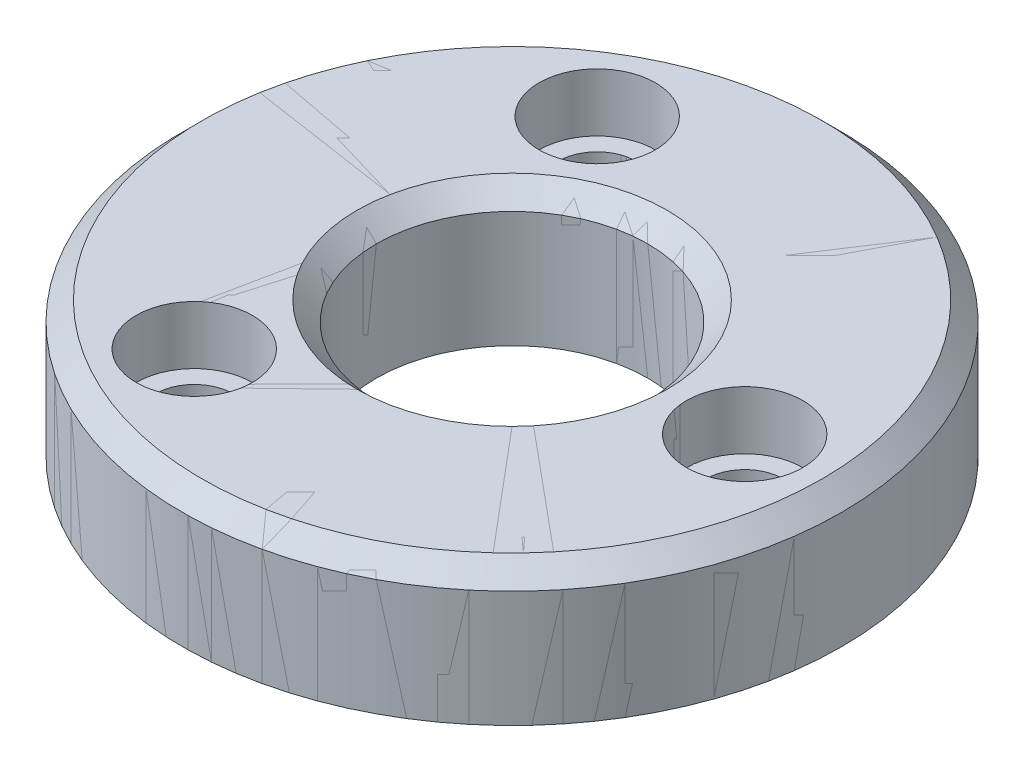
ISO-10303-21;
HEADER;
FILE_DESCRIPTION(('STEP AP214'),'2;1');
FILE_NAME('part.step','',(''),(''),'','','');
FILE_SCHEMA(('AUTOMOTIVE_DESIGN { 1 0 10303 214 1 1 1 1 }'));
ENDSEC;
DATA;
#1=APPLICATION_CONTEXT('core data for automotive mechanical design processes');
#2=APPLICATION_PROTOCOL_DEFINITION('international standard','automotive_design',2000,#1);
#3=PRODUCT_CONTEXT('',#1,'mechanical');
#4=PRODUCT('Part','Part','',(#3));
#5=PRODUCT_RELATED_PRODUCT_CATEGORY('part','',(#4));
#6=PRODUCT_DEFINITION_FORMATION('','',#4);
#7=PRODUCT_DEFINITION_CONTEXT('part definition',#1,'design');
#8=PRODUCT_DEFINITION('design','',#6,#7);
#9=PRODUCT_DEFINITION_SHAPE('','',#8);
#10=(LENGTH_UNIT() NAMED_UNIT(*) SI_UNIT(.MILLI.,.METRE.));
#11=(NAMED_UNIT(*) PLANE_ANGLE_UNIT() SI_UNIT($,.RADIAN.));
#12=(NAMED_UNIT(*) SI_UNIT($,.STERADIAN.) SOLID_ANGLE_UNIT());
#13=UNCERTAINTY_MEASURE_WITH_UNIT(LENGTH_MEASURE(1.E-05),#10,'distance_accuracy_value','');
#14=(GEOMETRIC_REPRESENTATION_CONTEXT(3) GLOBAL_UNCERTAINTY_ASSIGNED_CONTEXT((#13)) GLOBAL_UNIT_ASSIGNED_CONTEXT((#10,
#11,#12)) REPRESENTATION_CONTEXT('',''));
#15=CARTESIAN_POINT('',(0.,0.,0.));
#16=DIRECTION('',(0.,0.,1.));
#17=DIRECTION('',(1.,0.,0.));
#18=AXIS2_PLACEMENT_3D('',#15,#16,#17);
#19=CARTESIAN_POINT('',(-6.99999999999998,0.,0.));
#20=DIRECTION('',(0.,1.,0.));
#21=DIRECTION('',(-1.,0.,0.));
#22=AXIS2_PLACEMENT_3D('',#19,#20,#21);
#23=PLANE('',#22);
#24=CARTESIAN_POINT('',(-6.00000000000001,-1.10154940724527E-13,-10.3923048454133));
#25=DIRECTION('',(0.,1.,0.));
#26=DIRECTION('',(-1.,0.,0.));
#27=AXIS2_PLACEMENT_3D('',#24,#25,#26);
#28=CIRCLE('',#27,2.);
#29=CARTESIAN_POINT('',(-8.00000000000001,-1.17015438722299E-13,-10.3923048454133));
#30=VERTEX_POINT('',#29);
#31=EDGE_CURVE('E103',#30,#30,#28,.T.);
#32=ORIENTED_EDGE('',*,*,#31,.T.);
#33=EDGE_LOOP('',(#32));
#34=FACE_BOUND('',#33,.T.);
#35=CARTESIAN_POINT('',(12.,0.,0.));
#36=DIRECTION('',(0.,1.,0.));
#37=DIRECTION('',(-1.,0.,0.));
#38=AXIS2_PLACEMENT_3D('',#35,#36,#37);
#39=CIRCLE('',#38,2.);
#40=CARTESIAN_POINT('',(10.,0.,0.));
#41=VERTEX_POINT('',#40);
#42=EDGE_CURVE('E107',#41,#41,#39,.T.);
#43=ORIENTED_EDGE('',*,*,#42,.T.);
#44=EDGE_LOOP('',(#43));
#45=FACE_BOUND('',#44,.T.);
#46=CARTESIAN_POINT('',(-6.,-1.10154940724527E-13,10.3923048454133));
#47=DIRECTION('',(0.,1.,0.));
#48=DIRECTION('',(-1.,0.,0.));
#49=AXIS2_PLACEMENT_3D('',#46,#47,#48);
#50=CIRCLE('',#49,2.);
#51=CARTESIAN_POINT('',(-8.,-1.17015438722299E-13,10.3923048454133));
#52=VERTEX_POINT('',#51);
#53=EDGE_CURVE('E104',#52,#52,#50,.T.);
#54=ORIENTED_EDGE('',*,*,#53,.T.);
#55=EDGE_LOOP('',(#54));
#56=FACE_BOUND('',#55,.T.);
#57=CARTESIAN_POINT('',(0.,0.,0.));
#58=DIRECTION('',(0.,-1.,0.));
#59=DIRECTION('',(1.,0.,0.));
#60=AXIS2_PLACEMENT_3D('',#57,#58,#59);
#61=CIRCLE('',#60,6.99999999999998);
#62=CARTESIAN_POINT('',(6.99999999999998,0.,0.));
#63=VERTEX_POINT('',#62);
#64=EDGE_CURVE('E73',#63,#63,#61,.T.);
#65=ORIENTED_EDGE('',*,*,#64,.F.);
#66=EDGE_LOOP('',(#65));
#67=FACE_BOUND('',#66,.T.);
#68=CARTESIAN_POINT('',(0.,0.,0.));
#69=DIRECTION('',(0.,-1.,0.));
#70=DIRECTION('',(1.,0.,0.));
#71=AXIS2_PLACEMENT_3D('',#68,#69,#70);
#72=CIRCLE('',#71,17.);
#73=CARTESIAN_POINT('',(17.,1.13825384212316E-13,0.));
#74=VERTEX_POINT('',#73);
#75=EDGE_CURVE('E11',#74,#74,#72,.T.);
#76=ORIENTED_EDGE('',*,*,#75,.T.);
#77=EDGE_LOOP('',(#76));
#78=FACE_BOUND('',#77,.T.);
#79=ADVANCED_FACE('F51',(#34,#45,#56,#67,#78),#23,.F.);
#80=CARTESIAN_POINT('',(9.21065151376785E-13,-268.512621584022,0.));
#81=DIRECTION('',(0.,-1.,0.));
#82=DIRECTION('',(1.,0.,0.));
#83=AXIS2_PLACEMENT_3D('',#80,#81,#82);
#84=CYLINDRICAL_SURFACE('',#83,17.);
#85=ORIENTED_EDGE('',*,*,#75,.F.);
#86=EDGE_LOOP('',(#85));
#87=FACE_BOUND('',#86,.T.);
#88=CARTESIAN_POINT('',(0.,6.00000000000006,0.));
#89=DIRECTION('',(0.,-1.,0.));
#90=DIRECTION('',(1.,0.,0.));
#91=AXIS2_PLACEMENT_3D('',#88,#89,#90);
#92=CIRCLE('',#91,17.);
#93=CARTESIAN_POINT('',(17.,6.00000000000012,0.));
#94=VERTEX_POINT('',#93);
#95=EDGE_CURVE('E57',#94,#94,#92,.T.);
#96=ORIENTED_EDGE('',*,*,#95,.T.);
#97=EDGE_LOOP('',(#96));
#98=FACE_BOUND('',#97,.T.);
#99=ADVANCED_FACE('F128',(#87,#98),#84,.T.);
#100=CARTESIAN_POINT('',(0.,7.00000000000006,0.));
#101=DIRECTION('',(0.,-1.,0.));
#102=DIRECTION('',(1.,0.,0.));
#103=AXIS2_PLACEMENT_3D('',#100,#101,#102);
#104=CONICAL_SURFACE('',#103,16.,0.78539816339745);
#105=ORIENTED_EDGE('',*,*,#95,.F.);
#106=EDGE_LOOP('',(#105));
#107=FACE_BOUND('',#106,.T.);
#108=CARTESIAN_POINT('',(0.,7.00000000000006,0.));
#109=DIRECTION('',(0.,-1.,0.));
#110=DIRECTION('',(1.,0.,0.));
#111=AXIS2_PLACEMENT_3D('',#108,#109,#110);
#112=CIRCLE('',#111,16.);
#113=CARTESIAN_POINT('',(15.9999999999999,7.00000000000012,0.));
#114=VERTEX_POINT('',#113);
#115=EDGE_CURVE('E61',#114,#114,#112,.T.);
#116=ORIENTED_EDGE('',*,*,#115,.T.);
#117=EDGE_LOOP('',(#116));
#118=FACE_BOUND('',#117,.T.);
#119=ADVANCED_FACE('F134',(#107,#118),#104,.T.);
#120=CARTESIAN_POINT('',(-8.,7.00000000000001,0.));
#121=DIRECTION('',(0.,-1.,0.));
#122=DIRECTION('',(1.,0.,0.));
#123=AXIS2_PLACEMENT_3D('',#120,#121,#122);
#124=PLANE('',#123);
#125=CARTESIAN_POINT('',(12.,7.00000000000008,0.));
#126=DIRECTION('',(0.,1.,0.));
#127=DIRECTION('',(-1.,0.,0.));
#128=AXIS2_PLACEMENT_3D('',#125,#126,#127);
#129=CIRCLE('',#128,3.);
#130=CARTESIAN_POINT('',(8.99999999999998,7.00000000000007,0.));
#131=VERTEX_POINT('',#130);
#132=EDGE_CURVE('E90',#131,#131,#129,.T.);
#133=ORIENTED_EDGE('',*,*,#132,.F.);
#134=EDGE_LOOP('',(#133));
#135=FACE_BOUND('',#134,.T.);
#136=CARTESIAN_POINT('',(-6.00000000000002,7.00000000000002,10.3923048454133));
#137=DIRECTION('',(0.,1.,0.));
#138=DIRECTION('',(-1.,0.,0.));
#139=AXIS2_PLACEMENT_3D('',#136,#137,#138);
#140=CIRCLE('',#139,3.);
#141=CARTESIAN_POINT('',(-9.00000000000002,7.00000000000001,10.3923048454133));
#142=VERTEX_POINT('',#141);
#143=EDGE_CURVE('E87',#142,#142,#140,.T.);
#144=ORIENTED_EDGE('',*,*,#143,.F.);
#145=EDGE_LOOP('',(#144));
#146=FACE_BOUND('',#145,.T.);
#147=CARTESIAN_POINT('',(-6.00000000000003,7.00000000000002,-10.3923048454133));
#148=DIRECTION('',(0.,1.,0.));
#149=DIRECTION('',(-1.,0.,0.));
#150=AXIS2_PLACEMENT_3D('',#147,#148,#149);
#151=CIRCLE('',#150,3.);
#152=CARTESIAN_POINT('',(-9.00000000000003,7.00000000000001,-10.3923048454133));
#153=VERTEX_POINT('',#152);
#154=EDGE_CURVE('E80',#153,#153,#151,.T.);
#155=ORIENTED_EDGE('',*,*,#154,.F.);
#156=EDGE_LOOP('',(#155));
#157=FACE_BOUND('',#156,.T.);
#158=ORIENTED_EDGE('',*,*,#115,.F.);
#159=EDGE_LOOP('',(#158));
#160=FACE_BOUND('',#159,.T.);
#161=CARTESIAN_POINT('',(0.,7.00000000000001,0.));
#162=DIRECTION('',(0.,-1.,0.));
#163=DIRECTION('',(1.,0.,0.));
#164=AXIS2_PLACEMENT_3D('',#161,#162,#163);
#165=CIRCLE('',#164,7.99999999999998);
#166=CARTESIAN_POINT('',(7.99999999999995,7.00000000000003,0.));
#167=VERTEX_POINT('',#166);
#168=EDGE_CURVE('E65',#167,#167,#165,.T.);
#169=ORIENTED_EDGE('',*,*,#168,.T.);
#170=EDGE_LOOP('',(#169));
#171=FACE_BOUND('',#170,.T.);
#172=ADVANCED_FACE('F139',(#135,#146,#157,#160,#171),#124,.F.);
#173=CARTESIAN_POINT('',(0.,6.00000000000001,0.));
#174=DIRECTION('',(0.,1.,0.));
#175=DIRECTION('',(-1.,0.,0.));
#176=AXIS2_PLACEMENT_3D('',#173,#174,#175);
#177=CONICAL_SURFACE('',#176,6.99999999999998,0.785398163397447);
#178=ORIENTED_EDGE('',*,*,#168,.F.);
#179=EDGE_LOOP('',(#178));
#180=FACE_BOUND('',#179,.T.);
#181=CARTESIAN_POINT('',(0.,6.00000000000001,0.));
#182=DIRECTION('',(0.,-1.,0.));
#183=DIRECTION('',(1.,0.,0.));
#184=AXIS2_PLACEMENT_3D('',#181,#182,#183);
#185=CIRCLE('',#184,6.99999999999998);
#186=CARTESIAN_POINT('',(6.99999999999996,6.00000000000003,0.));
#187=VERTEX_POINT('',#186);
#188=EDGE_CURVE('E70',#187,#187,#185,.T.);
#189=ORIENTED_EDGE('',*,*,#188,.T.);
#190=EDGE_LOOP('',(#189));
#191=FACE_BOUND('',#190,.T.);
#192=ADVANCED_FACE('F145',(#180,#191),#177,.F.);
#193=CARTESIAN_POINT('',(9.21065151376785E-13,-268.512621584022,0.));
#194=DIRECTION('',(0.,-1.,0.));
#195=DIRECTION('',(1.,0.,0.));
#196=AXIS2_PLACEMENT_3D('',#193,#194,#195);
#197=CYLINDRICAL_SURFACE('',#196,6.99999999999998);
#198=ORIENTED_EDGE('',*,*,#188,.F.);
#199=EDGE_LOOP('',(#198));
#200=FACE_BOUND('',#199,.T.);
#201=ORIENTED_EDGE('',*,*,#64,.T.);
#202=EDGE_LOOP('',(#201));
#203=FACE_BOUND('',#202,.T.);
#204=ADVANCED_FACE('F149',(#200,#203),#197,.F.);
#205=CARTESIAN_POINT('',(-6.00000000000002,4.00000000000002,-10.3923048454133));
#206=DIRECTION('',(0.,1.,0.));
#207=DIRECTION('',(-1.,0.,0.));
#208=AXIS2_PLACEMENT_3D('',#205,#206,#207);
#209=CYLINDRICAL_SURFACE('',#208,3.);
#210=CARTESIAN_POINT('',(-6.00000000000002,4.00000000000002,-10.3923048454133));
#211=DIRECTION('',(0.,1.,0.));
#212=DIRECTION('',(-1.,0.,0.));
#213=AXIS2_PLACEMENT_3D('',#210,#211,#212);
#214=CIRCLE('',#213,3.);
#215=CARTESIAN_POINT('',(-9.00000000000002,4.00000000000001,-10.3923048454133));
#216=VERTEX_POINT('',#215);
#217=EDGE_CURVE('E77',#216,#216,#214,.T.);
#218=ORIENTED_EDGE('',*,*,#217,.F.);
#219=EDGE_LOOP('',(#218));
#220=FACE_BOUND('',#219,.T.);
#221=ORIENTED_EDGE('',*,*,#154,.T.);
#222=EDGE_LOOP('',(#221));
#223=FACE_BOUND('',#222,.T.);
#224=ADVANCED_FACE('F153',(#220,#223),#209,.F.);
#225=CARTESIAN_POINT('',(-6.00000000000002,4.00000000000002,-10.3923048454133));
#226=DIRECTION('',(0.,1.,0.));
#227=DIRECTION('',(-1.,0.,0.));
#228=AXIS2_PLACEMENT_3D('',#225,#226,#227);
#229=PLANE('',#228);
#230=CARTESIAN_POINT('',(-6.00000000000002,4.00000000000002,-10.3923048454133));
#231=DIRECTION('',(0.,1.,0.));
#232=DIRECTION('',(-1.,0.,0.));
#233=AXIS2_PLACEMENT_3D('',#230,#231,#232);
#234=CIRCLE('',#233,2.);
#235=CARTESIAN_POINT('',(-8.00000000000002,4.00000000000001,-10.3923048454133));
#236=VERTEX_POINT('',#235);
#237=EDGE_CURVE('E81',#236,#236,#234,.T.);
#238=ORIENTED_EDGE('',*,*,#237,.F.);
#239=EDGE_LOOP('',(#238));
#240=FACE_BOUND('',#239,.T.);
#241=ORIENTED_EDGE('',*,*,#217,.T.);
#242=EDGE_LOOP('',(#241));
#243=FACE_BOUND('',#242,.T.);
#244=ADVANCED_FACE('F155',(#240,#243),#229,.T.);
#245=CARTESIAN_POINT('',(-6.00000000000001,4.00000000000002,10.3923048454133));
#246=DIRECTION('',(0.,1.,0.));
#247=DIRECTION('',(-1.,0.,0.));
#248=AXIS2_PLACEMENT_3D('',#245,#246,#247);
#249=CYLINDRICAL_SURFACE('',#248,3.);
#250=CARTESIAN_POINT('',(-6.00000000000001,4.00000000000002,10.3923048454133));
#251=DIRECTION('',(0.,1.,0.));
#252=DIRECTION('',(-1.,0.,0.));
#253=AXIS2_PLACEMENT_3D('',#250,#251,#252);
#254=CIRCLE('',#253,3.);
#255=CARTESIAN_POINT('',(-9.00000000000001,4.00000000000001,10.3923048454133));
#256=VERTEX_POINT('',#255);
#257=EDGE_CURVE('E84',#256,#256,#254,.T.);
#258=ORIENTED_EDGE('',*,*,#257,.F.);
#259=EDGE_LOOP('',(#258));
#260=FACE_BOUND('',#259,.T.);
#261=ORIENTED_EDGE('',*,*,#143,.T.);
#262=EDGE_LOOP('',(#261));
#263=FACE_BOUND('',#262,.T.);
#264=ADVANCED_FACE('F158',(#260,#263),#249,.F.);
#265=CARTESIAN_POINT('',(-6.00000000000001,4.00000000000002,10.3923048454133));
#266=DIRECTION('',(0.,1.,0.));
#267=DIRECTION('',(-1.,0.,0.));
#268=AXIS2_PLACEMENT_3D('',#265,#266,#267);
#269=PLANE('',#268);
#270=CARTESIAN_POINT('',(-6.00000000000001,4.00000000000002,10.3923048454133));
#271=DIRECTION('',(0.,1.,0.));
#272=DIRECTION('',(-1.,0.,0.));
#273=AXIS2_PLACEMENT_3D('',#270,#271,#272);
#274=CIRCLE('',#273,2.);
#275=CARTESIAN_POINT('',(-8.00000000000001,4.00000000000001,10.3923048454133));
#276=VERTEX_POINT('',#275);
#277=EDGE_CURVE('E97',#276,#276,#274,.T.);
#278=ORIENTED_EDGE('',*,*,#277,.F.);
#279=EDGE_LOOP('',(#278));
#280=FACE_BOUND('',#279,.T.);
#281=ORIENTED_EDGE('',*,*,#257,.T.);
#282=EDGE_LOOP('',(#281));
#283=FACE_BOUND('',#282,.T.);
#284=ADVANCED_FACE('F163',(#280,#283),#269,.T.);
#285=CARTESIAN_POINT('',(12.,4.00000000000008,0.));
#286=DIRECTION('',(0.,1.,0.));
#287=DIRECTION('',(-1.,0.,0.));
#288=AXIS2_PLACEMENT_3D('',#285,#286,#287);
#289=CYLINDRICAL_SURFACE('',#288,3.);
#290=CARTESIAN_POINT('',(12.,4.00000000000008,0.));
#291=DIRECTION('',(0.,1.,0.));
#292=DIRECTION('',(-1.,0.,0.));
#293=AXIS2_PLACEMENT_3D('',#290,#291,#292);
#294=CIRCLE('',#293,3.);
#295=CARTESIAN_POINT('',(8.99999999999999,4.00000000000007,0.));
#296=VERTEX_POINT('',#295);
#297=EDGE_CURVE('E76',#296,#296,#294,.T.);
#298=ORIENTED_EDGE('',*,*,#297,.F.);
#299=EDGE_LOOP('',(#298));
#300=FACE_BOUND('',#299,.T.);
#301=ORIENTED_EDGE('',*,*,#132,.T.);
#302=EDGE_LOOP('',(#301));
#303=FACE_BOUND('',#302,.T.);
#304=ADVANCED_FACE('F166',(#300,#303),#289,.F.);
#305=CARTESIAN_POINT('',(12.,4.00000000000008,0.));
#306=DIRECTION('',(0.,1.,0.));
#307=DIRECTION('',(-1.,0.,0.));
#308=AXIS2_PLACEMENT_3D('',#305,#306,#307);
#309=PLANE('',#308);
#310=CARTESIAN_POINT('',(12.,4.00000000000008,0.));
#311=DIRECTION('',(0.,1.,0.));
#312=DIRECTION('',(-1.,0.,0.));
#313=AXIS2_PLACEMENT_3D('',#310,#311,#312);
#314=CIRCLE('',#313,2.);
#315=CARTESIAN_POINT('',(9.99999999999998,4.00000000000008,0.));
#316=VERTEX_POINT('',#315);
#317=EDGE_CURVE('E100',#316,#316,#314,.T.);
#318=ORIENTED_EDGE('',*,*,#317,.F.);
#319=EDGE_LOOP('',(#318));
#320=FACE_BOUND('',#319,.T.);
#321=ORIENTED_EDGE('',*,*,#297,.T.);
#322=EDGE_LOOP('',(#321));
#323=FACE_BOUND('',#322,.T.);
#324=ADVANCED_FACE('F173',(#320,#323),#309,.T.);
#325=CARTESIAN_POINT('',(12.,0.,0.));
#326=DIRECTION('',(0.,1.,0.));
#327=DIRECTION('',(-1.,0.,0.));
#328=AXIS2_PLACEMENT_3D('',#325,#326,#327);
#329=CYLINDRICAL_SURFACE('',#328,2.);
#330=ORIENTED_EDGE('',*,*,#317,.T.);
#331=EDGE_LOOP('',(#330));
#332=FACE_BOUND('',#331,.T.);
#333=ORIENTED_EDGE('',*,*,#42,.F.);
#334=EDGE_LOOP('',(#333));
#335=FACE_BOUND('',#334,.T.);
#336=ADVANCED_FACE('F123',(#332,#335),#329,.F.);
#337=CARTESIAN_POINT('',(-6.,-1.10154940724527E-13,10.3923048454133));
#338=DIRECTION('',(0.,1.,0.));
#339=DIRECTION('',(-1.,0.,0.));
#340=AXIS2_PLACEMENT_3D('',#337,#338,#339);
#341=CYLINDRICAL_SURFACE('',#340,2.);
#342=ORIENTED_EDGE('',*,*,#277,.T.);
#343=EDGE_LOOP('',(#342));
#344=FACE_BOUND('',#343,.T.);
#345=ORIENTED_EDGE('',*,*,#53,.F.);
#346=EDGE_LOOP('',(#345));
#347=FACE_BOUND('',#346,.T.);
#348=ADVANCED_FACE('F117',(#344,#347),#341,.F.);
#349=CARTESIAN_POINT('',(-6.00000000000001,-1.10154940724527E-13,-10.3923048454133));
#350=DIRECTION('',(0.,1.,0.));
#351=DIRECTION('',(-1.,0.,0.));
#352=AXIS2_PLACEMENT_3D('',#349,#350,#351);
#353=CYLINDRICAL_SURFACE('',#352,2.);
#354=ORIENTED_EDGE('',*,*,#237,.T.);
#355=EDGE_LOOP('',(#354));
#356=FACE_BOUND('',#355,.T.);
#357=ORIENTED_EDGE('',*,*,#31,.F.);
#358=EDGE_LOOP('',(#357));
#359=FACE_BOUND('',#358,.T.);
#360=ADVANCED_FACE('F115',(#356,#359),#353,.F.);
#361=CLOSED_SHELL('',(#79,#99,#119,#172,#192,#204,#224,#244,#264,#284,#304,#324,#336,#348,#360));
#362=MANIFOLD_SOLID_BREP('B2',#361);
#363=CARTESIAN_POINT('',(9.21065151376785E-13,-268.512621584022,0.));
#364=DIRECTION('',(0.,-1.,0.));
#365=DIRECTION('',(1.,0.,0.));
#366=AXIS2_PLACEMENT_3D('',#363,#364,#365);
#367=CYLINDRICAL_SURFACE('',#366,7.);
#368=CARTESIAN_POINT('',(0.,0.,0.));
#369=DIRECTION('',(0.,-1.,0.));
#370=DIRECTION('',(1.,0.,0.));
#371=AXIS2_PLACEMENT_3D('',#368,#369,#370);
#372=CIRCLE('',#371,6.99999999999998);
#373=CARTESIAN_POINT('',(6.99999999999998,0.,0.));
#374=VERTEX_POINT('',#373);
#375=EDGE_CURVE('E323',#374,#374,#372,.T.);
#376=ORIENTED_EDGE('',*,*,#375,.T.);
#377=EDGE_LOOP('',(#376));
#378=FACE_BOUND('',#377,.T.);
#379=CARTESIAN_POINT('',(0.,6.00000000000001,0.));
#380=DIRECTION('',(0.,-1.,0.));
#381=DIRECTION('',(1.,0.,0.));
#382=AXIS2_PLACEMENT_3D('',#379,#380,#381);
#383=CIRCLE('',#382,7.00000000000002);
#384=CARTESIAN_POINT('',(7.,6.00000000000003,0.));
#385=VERTEX_POINT('',#384);
#386=EDGE_CURVE('E50',#385,#385,#383,.T.);
#387=ORIENTED_EDGE('',*,*,#386,.F.);
#388=EDGE_LOOP('',(#387));
#389=FACE_BOUND('',#388,.T.);
#390=ADVANCED_FACE('F296',(#378,#389),#367,.F.);
#391=CARTESIAN_POINT('',(0.,7.00000000000001,0.));
#392=DIRECTION('',(0.,1.,0.));
#393=DIRECTION('',(-1.,0.,0.));
#394=AXIS2_PLACEMENT_3D('',#391,#392,#393);
#395=CONICAL_SURFACE('',#394,8.00000000000002,0.785398163397451);
#396=ORIENTED_EDGE('',*,*,#386,.T.);
#397=EDGE_LOOP('',(#396));
#398=FACE_BOUND('',#397,.T.);
#399=CARTESIAN_POINT('',(0.,7.00000000000001,0.));
#400=DIRECTION('',(0.,-1.,0.));
#401=DIRECTION('',(1.,0.,0.));
#402=AXIS2_PLACEMENT_3D('',#399,#400,#401);
#403=CIRCLE('',#402,8.00000000000002);
#404=CARTESIAN_POINT('',(8.,7.00000000000003,0.));
#405=VERTEX_POINT('',#404);
#406=EDGE_CURVE('E303',#405,#405,#403,.T.);
#407=ORIENTED_EDGE('',*,*,#406,.F.);
#408=EDGE_LOOP('',(#407));
#409=FACE_BOUND('',#408,.T.);
#410=ADVANCED_FACE('F392',(#398,#409),#395,.F.);
#411=CARTESIAN_POINT('',(8.,6.99999999999999,0.));
#412=DIRECTION('',(0.,1.,0.));
#413=DIRECTION('',(-1.,0.,0.));
#414=AXIS2_PLACEMENT_3D('',#411,#412,#413);
#415=PLANE('',#414);
#416=CARTESIAN_POINT('',(12.,7.00000000000008,0.));
#417=DIRECTION('',(0.,1.,0.));
#418=DIRECTION('',(-1.,0.,0.));
#419=AXIS2_PLACEMENT_3D('',#416,#417,#418);
#420=CIRCLE('',#419,3.);
#421=CARTESIAN_POINT('',(8.99999999999998,7.00000000000007,0.));
#422=VERTEX_POINT('',#421);
#423=EDGE_CURVE('E345',#422,#422,#420,.T.);
#424=ORIENTED_EDGE('',*,*,#423,.F.);
#425=EDGE_LOOP('',(#424));
#426=FACE_BOUND('',#425,.T.);
#427=CARTESIAN_POINT('',(-6.00000000000002,7.00000000000002,10.3923048454133));
#428=DIRECTION('',(0.,1.,0.));
#429=DIRECTION('',(-1.,0.,0.));
#430=AXIS2_PLACEMENT_3D('',#427,#428,#429);
#431=CIRCLE('',#430,3.);
#432=CARTESIAN_POINT('',(-9.00000000000002,7.00000000000001,10.3923048454133));
#433=VERTEX_POINT('',#432);
#434=EDGE_CURVE('E341',#433,#433,#431,.T.);
#435=ORIENTED_EDGE('',*,*,#434,.F.);
#436=EDGE_LOOP('',(#435));
#437=FACE_BOUND('',#436,.T.);
#438=CARTESIAN_POINT('',(-6.00000000000003,7.00000000000002,-10.3923048454133));
#439=DIRECTION('',(0.,1.,0.));
#440=DIRECTION('',(-1.,0.,0.));
#441=AXIS2_PLACEMENT_3D('',#438,#439,#440);
#442=CIRCLE('',#441,3.);
#443=CARTESIAN_POINT('',(-9.00000000000003,7.00000000000001,-10.3923048454133));
#444=VERTEX_POINT('',#443);
#445=EDGE_CURVE('E332',#444,#444,#442,.T.);
#446=ORIENTED_EDGE('',*,*,#445,.F.);
#447=EDGE_LOOP('',(#446));
#448=FACE_BOUND('',#447,.T.);
#449=ORIENTED_EDGE('',*,*,#406,.T.);
#450=EDGE_LOOP('',(#449));
#451=FACE_BOUND('',#450,.T.);
#452=CARTESIAN_POINT('',(0.,6.99999999999995,0.));
#453=DIRECTION('',(0.,-1.,0.));
#454=DIRECTION('',(1.,0.,0.));
#455=AXIS2_PLACEMENT_3D('',#452,#453,#454);
#456=CIRCLE('',#455,16.);
#457=CARTESIAN_POINT('',(16.,7.00000000000001,0.));
#458=VERTEX_POINT('',#457);
#459=EDGE_CURVE('E308',#458,#458,#456,.T.);
#460=ORIENTED_EDGE('',*,*,#459,.F.);
#461=EDGE_LOOP('',(#460));
#462=FACE_BOUND('',#461,.T.);
#463=ADVANCED_FACE('F397',(#426,#437,#448,#451,#462),#415,.T.);
#464=CARTESIAN_POINT('',(0.,5.99999999999995,0.));
#465=DIRECTION('',(0.,-1.,0.));
#466=DIRECTION('',(1.,0.,0.));
#467=AXIS2_PLACEMENT_3D('',#464,#465,#466);
#468=CONICAL_SURFACE('',#467,17.,0.785398163397447);
#469=ORIENTED_EDGE('',*,*,#459,.T.);
#470=EDGE_LOOP('',(#469));
#471=FACE_BOUND('',#470,.T.);
#472=CARTESIAN_POINT('',(0.,5.99999999999995,0.));
#473=DIRECTION('',(0.,-1.,0.));
#474=DIRECTION('',(1.,0.,0.));
#475=AXIS2_PLACEMENT_3D('',#472,#473,#474);
#476=CIRCLE('',#475,17.);
#477=CARTESIAN_POINT('',(17.,6.00000000000001,0.));
#478=VERTEX_POINT('',#477);
#479=EDGE_CURVE('E313',#478,#478,#476,.T.);
#480=ORIENTED_EDGE('',*,*,#479,.F.);
#481=EDGE_LOOP('',(#480));
#482=FACE_BOUND('',#481,.T.);
#483=ADVANCED_FACE('F414',(#471,#482),#468,.T.);
#484=CARTESIAN_POINT('',(9.21065151376785E-13,-268.512621584022,0.));
#485=DIRECTION('',(0.,-1.,0.));
#486=DIRECTION('',(1.,0.,0.));
#487=AXIS2_PLACEMENT_3D('',#484,#485,#486);
#488=CYLINDRICAL_SURFACE('',#487,17.);
#489=ORIENTED_EDGE('',*,*,#479,.T.);
#490=EDGE_LOOP('',(#489));
#491=FACE_BOUND('',#490,.T.);
#492=CARTESIAN_POINT('',(0.,0.,0.));
#493=DIRECTION('',(0.,-1.,0.));
#494=DIRECTION('',(1.,0.,0.));
#495=AXIS2_PLACEMENT_3D('',#492,#493,#494);
#496=CIRCLE('',#495,17.);
#497=CARTESIAN_POINT('',(17.,0.,0.));
#498=VERTEX_POINT('',#497);
#499=EDGE_CURVE('E319',#498,#498,#496,.T.);
#500=ORIENTED_EDGE('',*,*,#499,.F.);
#501=EDGE_LOOP('',(#500));
#502=FACE_BOUND('',#501,.T.);
#503=ADVANCED_FACE('F403',(#491,#502),#488,.T.);
#504=CARTESIAN_POINT('',(6.99999999999998,0.,0.));
#505=DIRECTION('',(0.,-1.,0.));
#506=DIRECTION('',(1.,0.,0.));
#507=AXIS2_PLACEMENT_3D('',#504,#505,#506);
#508=PLANE('',#507);
#509=CARTESIAN_POINT('',(-6.00000000000001,-1.10154940724527E-13,-10.3923048454133));
#510=DIRECTION('',(0.,1.,0.));
#511=DIRECTION('',(-1.,0.,0.));
#512=AXIS2_PLACEMENT_3D('',#509,#510,#511);
#513=CIRCLE('',#512,2.);
#514=CARTESIAN_POINT('',(-8.00000000000001,-1.17015438722299E-13,-10.3923048454133));
#515=VERTEX_POINT('',#514);
#516=EDGE_CURVE('E363',#515,#515,#513,.T.);
#517=ORIENTED_EDGE('',*,*,#516,.T.);
#518=EDGE_LOOP('',(#517));
#519=FACE_BOUND('',#518,.T.);
#520=CARTESIAN_POINT('',(12.,0.,0.));
#521=DIRECTION('',(0.,1.,0.));
#522=DIRECTION('',(-1.,0.,0.));
#523=AXIS2_PLACEMENT_3D('',#520,#521,#522);
#524=CIRCLE('',#523,2.);
#525=CARTESIAN_POINT('',(10.,0.,0.));
#526=VERTEX_POINT('',#525);
#527=EDGE_CURVE('E368',#526,#526,#524,.T.);
#528=ORIENTED_EDGE('',*,*,#527,.T.);
#529=EDGE_LOOP('',(#528));
#530=FACE_BOUND('',#529,.T.);
#531=CARTESIAN_POINT('',(-6.,-1.10154940724527E-13,10.3923048454133));
#532=DIRECTION('',(0.,1.,0.));
#533=DIRECTION('',(-1.,0.,0.));
#534=AXIS2_PLACEMENT_3D('',#531,#532,#533);
#535=CIRCLE('',#534,2.);
#536=CARTESIAN_POINT('',(-8.,-1.17015438722299E-13,10.3923048454133));
#537=VERTEX_POINT('',#536);
#538=EDGE_CURVE('E364',#537,#537,#535,.T.);
#539=ORIENTED_EDGE('',*,*,#538,.T.);
#540=EDGE_LOOP('',(#539));
#541=FACE_BOUND('',#540,.T.);
#542=ORIENTED_EDGE('',*,*,#499,.T.);
#543=EDGE_LOOP('',(#542));
#544=FACE_BOUND('',#543,.T.);
#545=ORIENTED_EDGE('',*,*,#375,.F.);
#546=EDGE_LOOP('',(#545));
#547=FACE_BOUND('',#546,.T.);
#548=ADVANCED_FACE('F376',(#519,#530,#541,#544,#547),#508,.T.);
#549=CARTESIAN_POINT('',(-6.00000000000002,4.00000000000002,-10.3923048454133));
#550=DIRECTION('',(0.,1.,0.));
#551=DIRECTION('',(-1.,0.,0.));
#552=AXIS2_PLACEMENT_3D('',#549,#550,#551);
#553=CYLINDRICAL_SURFACE('',#552,3.);
#554=CARTESIAN_POINT('',(-6.00000000000002,4.00000000000002,-10.3923048454133));
#555=DIRECTION('',(0.,1.,0.));
#556=DIRECTION('',(-1.,0.,0.));
#557=AXIS2_PLACEMENT_3D('',#554,#555,#556);
#558=CIRCLE('',#557,3.);
#559=CARTESIAN_POINT('',(-9.00000000000002,4.00000000000001,-10.3923048454133));
#560=VERTEX_POINT('',#559);
#561=EDGE_CURVE('E328',#560,#560,#558,.T.);
#562=ORIENTED_EDGE('',*,*,#561,.F.);
#563=EDGE_LOOP('',(#562));
#564=FACE_BOUND('',#563,.T.);
#565=ORIENTED_EDGE('',*,*,#445,.T.);
#566=EDGE_LOOP('',(#565));
#567=FACE_BOUND('',#566,.T.);
#568=ADVANCED_FACE('F402',(#564,#567),#553,.F.);
#569=CARTESIAN_POINT('',(-6.00000000000002,4.00000000000002,-10.3923048454133));
#570=DIRECTION('',(0.,1.,0.));
#571=DIRECTION('',(-1.,0.,0.));
#572=AXIS2_PLACEMENT_3D('',#569,#570,#571);
#573=PLANE('',#572);
#574=CARTESIAN_POINT('',(-6.00000000000002,4.00000000000002,-10.3923048454133));
#575=DIRECTION('',(0.,1.,0.));
#576=DIRECTION('',(-1.,0.,0.));
#577=AXIS2_PLACEMENT_3D('',#574,#575,#576);
#578=CIRCLE('',#577,2.);
#579=CARTESIAN_POINT('',(-8.00000000000002,4.00000000000001,-10.3923048454133));
#580=VERTEX_POINT('',#579);
#581=EDGE_CURVE('E333',#580,#580,#578,.T.);
#582=ORIENTED_EDGE('',*,*,#581,.F.);
#583=EDGE_LOOP('',(#582));
#584=FACE_BOUND('',#583,.T.);
#585=ORIENTED_EDGE('',*,*,#561,.T.);
#586=EDGE_LOOP('',(#585));
#587=FACE_BOUND('',#586,.T.);
#588=ADVANCED_FACE('F410',(#584,#587),#573,.T.);
#589=CARTESIAN_POINT('',(-6.00000000000001,4.00000000000002,10.3923048454133));
#590=DIRECTION('',(0.,1.,0.));
#591=DIRECTION('',(-1.,0.,0.));
#592=AXIS2_PLACEMENT_3D('',#589,#590,#591);
#593=CYLINDRICAL_SURFACE('',#592,3.);
#594=CARTESIAN_POINT('',(-6.00000000000001,4.00000000000002,10.3923048454133));
#595=DIRECTION('',(0.,1.,0.));
#596=DIRECTION('',(-1.,0.,0.));
#597=AXIS2_PLACEMENT_3D('',#594,#595,#596);
#598=CIRCLE('',#597,3.);
#599=CARTESIAN_POINT('',(-9.00000000000001,4.00000000000001,10.3923048454133));
#600=VERTEX_POINT('',#599);
#601=EDGE_CURVE('E337',#600,#600,#598,.T.);
#602=ORIENTED_EDGE('',*,*,#601,.F.);
#603=EDGE_LOOP('',(#602));
#604=FACE_BOUND('',#603,.T.);
#605=ORIENTED_EDGE('',*,*,#434,.T.);
#606=EDGE_LOOP('',(#605));
#607=FACE_BOUND('',#606,.T.);
#608=ADVANCED_FACE('F440',(#604,#607),#593,.F.);
#609=CARTESIAN_POINT('',(-6.00000000000001,4.00000000000002,10.3923048454133));
#610=DIRECTION('',(0.,1.,0.));
#611=DIRECTION('',(-1.,0.,0.));
#612=AXIS2_PLACEMENT_3D('',#609,#610,#611);
#613=PLANE('',#612);
#614=CARTESIAN_POINT('',(-6.00000000000001,4.00000000000002,10.3923048454133));
#615=DIRECTION('',(0.,1.,0.));
#616=DIRECTION('',(-1.,0.,0.));
#617=AXIS2_PLACEMENT_3D('',#614,#615,#616);
#618=CIRCLE('',#617,2.);
#619=CARTESIAN_POINT('',(-8.00000000000001,4.00000000000001,10.3923048454133));
#620=VERTEX_POINT('',#619);
#621=EDGE_CURVE('E355',#620,#620,#618,.T.);
#622=ORIENTED_EDGE('',*,*,#621,.F.);
#623=EDGE_LOOP('',(#622));
#624=FACE_BOUND('',#623,.T.);
#625=ORIENTED_EDGE('',*,*,#601,.T.);
#626=EDGE_LOOP('',(#625));
#627=FACE_BOUND('',#626,.T.);
#628=ADVANCED_FACE('F442',(#624,#627),#613,.T.);
#629=CARTESIAN_POINT('',(12.,4.00000000000008,0.));
#630=DIRECTION('',(0.,1.,0.));
#631=DIRECTION('',(-1.,0.,0.));
#632=AXIS2_PLACEMENT_3D('',#629,#630,#631);
#633=CYLINDRICAL_SURFACE('',#632,3.);
#634=CARTESIAN_POINT('',(12.,4.00000000000008,0.));
#635=DIRECTION('',(0.,1.,0.));
#636=DIRECTION('',(-1.,0.,0.));
#637=AXIS2_PLACEMENT_3D('',#634,#635,#636);
#638=CIRCLE('',#637,3.);
#639=CARTESIAN_POINT('',(8.99999999999999,4.00000000000007,0.));
#640=VERTEX_POINT('',#639);
#641=EDGE_CURVE('E327',#640,#640,#638,.T.);
#642=ORIENTED_EDGE('',*,*,#641,.F.);
#643=EDGE_LOOP('',(#642));
#644=FACE_BOUND('',#643,.T.);
#645=ORIENTED_EDGE('',*,*,#423,.T.);
#646=EDGE_LOOP('',(#645));
#647=FACE_BOUND('',#646,.T.);
#648=ADVANCED_FACE('F449',(#644,#647),#633,.F.);
#649=CARTESIAN_POINT('',(12.,4.00000000000008,0.));
#650=DIRECTION('',(0.,1.,0.));
#651=DIRECTION('',(-1.,0.,0.));
#652=AXIS2_PLACEMENT_3D('',#649,#650,#651);
#653=PLANE('',#652);
#654=CARTESIAN_POINT('',(12.,4.00000000000008,0.));
#655=DIRECTION('',(0.,1.,0.));
#656=DIRECTION('',(-1.,0.,0.));
#657=AXIS2_PLACEMENT_3D('',#654,#655,#656);
#658=CIRCLE('',#657,2.);
#659=CARTESIAN_POINT('',(9.99999999999998,4.00000000000008,0.));
#660=VERTEX_POINT('',#659);
#661=EDGE_CURVE('E359',#660,#660,#658,.T.);
#662=ORIENTED_EDGE('',*,*,#661,.F.);
#663=EDGE_LOOP('',(#662));
#664=FACE_BOUND('',#663,.T.);
#665=ORIENTED_EDGE('',*,*,#641,.T.);
#666=EDGE_LOOP('',(#665));
#667=FACE_BOUND('',#666,.T.);
#668=ADVANCED_FACE('F457',(#664,#667),#653,.T.);
#669=CARTESIAN_POINT('',(12.,0.,0.));
#670=DIRECTION('',(0.,1.,0.));
#671=DIRECTION('',(-1.,0.,0.));
#672=AXIS2_PLACEMENT_3D('',#669,#670,#671);
#673=CYLINDRICAL_SURFACE('',#672,2.);
#674=ORIENTED_EDGE('',*,*,#661,.T.);
#675=EDGE_LOOP('',(#674));
#676=FACE_BOUND('',#675,.T.);
#677=ORIENTED_EDGE('',*,*,#527,.F.);
#678=EDGE_LOOP('',(#677));
#679=FACE_BOUND('',#678,.T.);
#680=ADVANCED_FACE('F387',(#676,#679),#673,.F.);
#681=CARTESIAN_POINT('',(-6.,-1.10154940724527E-13,10.3923048454133));
#682=DIRECTION('',(0.,1.,0.));
#683=DIRECTION('',(-1.,0.,0.));
#684=AXIS2_PLACEMENT_3D('',#681,#682,#683);
#685=CYLINDRICAL_SURFACE('',#684,2.);
#686=ORIENTED_EDGE('',*,*,#621,.T.);
#687=EDGE_LOOP('',(#686));
#688=FACE_BOUND('',#687,.T.);
#689=ORIENTED_EDGE('',*,*,#538,.F.);
#690=EDGE_LOOP('',(#689));
#691=FACE_BOUND('',#690,.T.);
#692=ADVANCED_FACE('F381',(#688,#691),#685,.F.);
#693=CARTESIAN_POINT('',(-6.00000000000001,-1.10154940724527E-13,-10.3923048454133));
#694=DIRECTION('',(0.,1.,0.));
#695=DIRECTION('',(-1.,0.,0.));
#696=AXIS2_PLACEMENT_3D('',#693,#694,#695);
#697=CYLINDRICAL_SURFACE('',#696,2.);
#698=ORIENTED_EDGE('',*,*,#581,.T.);
#699=EDGE_LOOP('',(#698));
#700=FACE_BOUND('',#699,.T.);
#701=ORIENTED_EDGE('',*,*,#516,.F.);
#702=EDGE_LOOP('',(#701));
#703=FACE_BOUND('',#702,.T.);
#704=ADVANCED_FACE('F379',(#700,#703),#697,.F.);
#705=CLOSED_SHELL('',(#390,#410,#463,#483,#503,#548,#568,#588,#608,#628,#648,#668,#680,#692,#704));
#706=MANIFOLD_SOLID_BREP('B6',#705);
#707=ADVANCED_BREP_SHAPE_REPRESENTATION('',(#18,#362,#706),#14);
#708=SHAPE_DEFINITION_REPRESENTATION(#9,#707);
ENDSEC;
END-ISO-10303-21;
